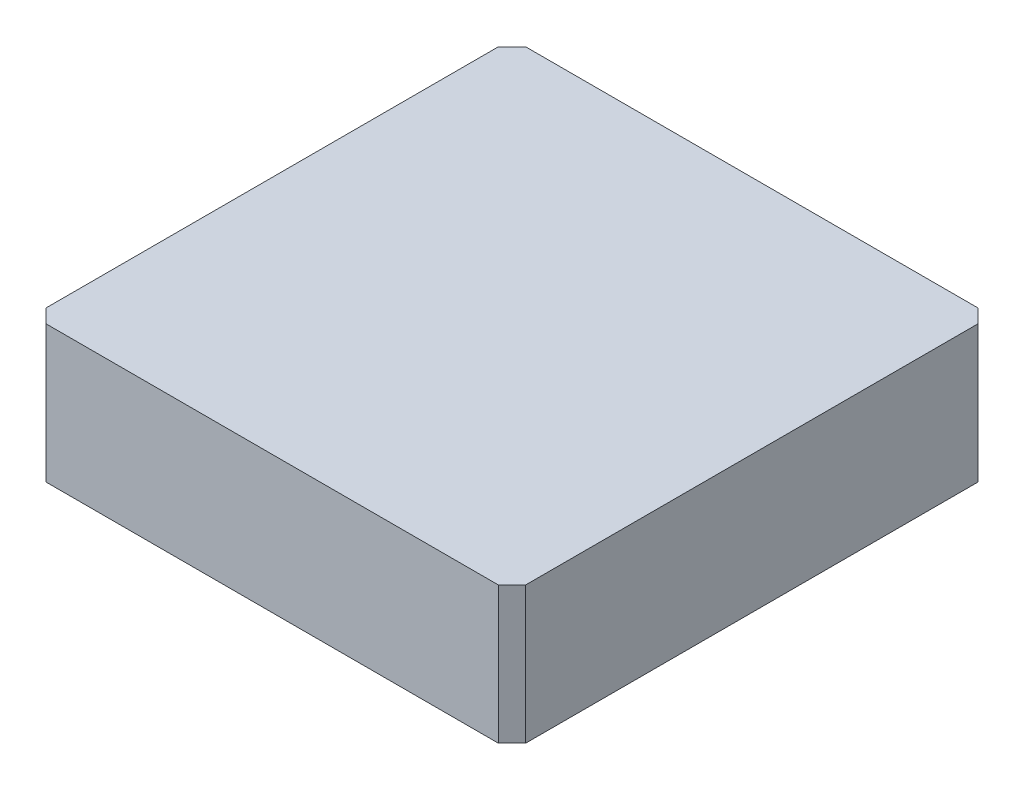
ISO-10303-21;
HEADER;
FILE_DESCRIPTION(('STEP AP214'),'2;1');
FILE_NAME('part.step','',(''),(''),'','','');
FILE_SCHEMA(('AUTOMOTIVE_DESIGN { 1 0 10303 214 1 1 1 1 }'));
ENDSEC;
DATA;
#1=APPLICATION_CONTEXT('core data for automotive mechanical design processes');
#2=APPLICATION_PROTOCOL_DEFINITION('international standard','automotive_design',2000,#1);
#3=PRODUCT_CONTEXT('',#1,'mechanical');
#4=PRODUCT('Part','Part','',(#3));
#5=PRODUCT_RELATED_PRODUCT_CATEGORY('part','',(#4));
#6=PRODUCT_DEFINITION_FORMATION('','',#4);
#7=PRODUCT_DEFINITION_CONTEXT('part definition',#1,'design');
#8=PRODUCT_DEFINITION('design','',#6,#7);
#9=PRODUCT_DEFINITION_SHAPE('','',#8);
#10=(LENGTH_UNIT() NAMED_UNIT(*) SI_UNIT(.MILLI.,.METRE.));
#11=(NAMED_UNIT(*) PLANE_ANGLE_UNIT() SI_UNIT($,.RADIAN.));
#12=(NAMED_UNIT(*) SI_UNIT($,.STERADIAN.) SOLID_ANGLE_UNIT());
#13=UNCERTAINTY_MEASURE_WITH_UNIT(LENGTH_MEASURE(1.E-05),#10,'distance_accuracy_value','');
#14=(GEOMETRIC_REPRESENTATION_CONTEXT(3) GLOBAL_UNCERTAINTY_ASSIGNED_CONTEXT((#13)) GLOBAL_UNIT_ASSIGNED_CONTEXT((#10,
#11,#12)) REPRESENTATION_CONTEXT('',''));
#15=CARTESIAN_POINT('',(0.,0.,0.));
#16=DIRECTION('',(0.,0.,1.));
#17=DIRECTION('',(1.,0.,0.));
#18=AXIS2_PLACEMENT_3D('',#15,#16,#17);
#19=CARTESIAN_POINT('',(-35.,20.,35.));
#20=DIRECTION('',(1.,0.,0.));
#21=DIRECTION('',(0.,0.,-1.));
#22=AXIS2_PLACEMENT_3D('',#19,#20,#21);
#23=PLANE('',#22);
#24=DIRECTION('',(0.,0.,1.));
#25=VECTOR('',#24,1.);
#26=CARTESIAN_POINT('',(-35.,0.,35.));
#27=LINE('',#26,#25);
#28=CARTESIAN_POINT('',(-35.,0.,-33.));
#29=VERTEX_POINT('',#28);
#30=CARTESIAN_POINT('',(-35.,0.,33.));
#31=VERTEX_POINT('',#30);
#32=EDGE_CURVE('E125',#29,#31,#27,.T.);
#33=ORIENTED_EDGE('',*,*,#32,.T.);
#34=DIRECTION('',(0.,1.,0.));
#35=VECTOR('',#34,1.);
#36=CARTESIAN_POINT('',(-35.,20.,33.));
#37=LINE('',#36,#35);
#38=CARTESIAN_POINT('',(-35.,20.,33.));
#39=VERTEX_POINT('',#38);
#40=EDGE_CURVE('E103',#31,#39,#37,.T.);
#41=ORIENTED_EDGE('',*,*,#40,.T.);
#42=DIRECTION('',(0.,0.,1.));
#43=VECTOR('',#42,1.);
#44=CARTESIAN_POINT('',(-35.,20.,35.));
#45=LINE('',#44,#43);
#46=CARTESIAN_POINT('',(-35.,20.,-33.));
#47=VERTEX_POINT('',#46);
#48=EDGE_CURVE('E134',#47,#39,#45,.T.);
#49=ORIENTED_EDGE('',*,*,#48,.F.);
#50=DIRECTION('',(0.,-1.,0.));
#51=VECTOR('',#50,1.);
#52=CARTESIAN_POINT('',(-35.,20.,-33.));
#53=LINE('',#52,#51);
#54=EDGE_CURVE('E108',#47,#29,#53,.T.);
#55=ORIENTED_EDGE('',*,*,#54,.T.);
#56=EDGE_LOOP('',(#33,#41,#49,#55));
#57=FACE_BOUND('',#56,.T.);
#58=ADVANCED_FACE('F32',(#57),#23,.F.);
#59=CARTESIAN_POINT('',(35.,20.,35.));
#60=DIRECTION('',(0.,0.,-1.));
#61=DIRECTION('',(-1.,0.,0.));
#62=AXIS2_PLACEMENT_3D('',#59,#60,#61);
#63=PLANE('',#62);
#64=DIRECTION('',(1.,0.,0.));
#65=VECTOR('',#64,1.);
#66=CARTESIAN_POINT('',(35.,20.,35.));
#67=LINE('',#66,#65);
#68=CARTESIAN_POINT('',(-33.,20.,35.));
#69=VERTEX_POINT('',#68);
#70=CARTESIAN_POINT('',(33.,20.,35.));
#71=VERTEX_POINT('',#70);
#72=EDGE_CURVE('E118',#69,#71,#67,.T.);
#73=ORIENTED_EDGE('',*,*,#72,.F.);
#74=DIRECTION('',(0.,-1.,0.));
#75=VECTOR('',#74,1.);
#76=CARTESIAN_POINT('',(-33.,20.,35.));
#77=LINE('',#76,#75);
#78=CARTESIAN_POINT('',(-33.,0.,35.));
#79=VERTEX_POINT('',#78);
#80=EDGE_CURVE('E102',#69,#79,#77,.T.);
#81=ORIENTED_EDGE('',*,*,#80,.T.);
#82=DIRECTION('',(1.,0.,0.));
#83=VECTOR('',#82,1.);
#84=CARTESIAN_POINT('',(35.,0.,35.));
#85=LINE('',#84,#83);
#86=CARTESIAN_POINT('',(33.,0.,35.));
#87=VERTEX_POINT('',#86);
#88=EDGE_CURVE('E115',#79,#87,#85,.T.);
#89=ORIENTED_EDGE('',*,*,#88,.T.);
#90=DIRECTION('',(0.,1.,0.));
#91=VECTOR('',#90,1.);
#92=CARTESIAN_POINT('',(33.,20.,35.));
#93=LINE('',#92,#91);
#94=EDGE_CURVE('E120',#87,#71,#93,.T.);
#95=ORIENTED_EDGE('',*,*,#94,.T.);
#96=EDGE_LOOP('',(#73,#81,#89,#95));
#97=FACE_BOUND('',#96,.T.);
#98=ADVANCED_FACE('F114',(#97),#63,.F.);
#99=CARTESIAN_POINT('',(35.,20.,35.));
#100=DIRECTION('',(-1.,0.,0.));
#101=DIRECTION('',(0.,0.,1.));
#102=AXIS2_PLACEMENT_3D('',#99,#100,#101);
#103=PLANE('',#102);
#104=DIRECTION('',(0.,0.,-1.));
#105=VECTOR('',#104,1.);
#106=CARTESIAN_POINT('',(35.,0.,35.));
#107=LINE('',#106,#105);
#108=CARTESIAN_POINT('',(35.,0.,33.));
#109=VERTEX_POINT('',#108);
#110=CARTESIAN_POINT('',(35.,0.,-33.));
#111=VERTEX_POINT('',#110);
#112=EDGE_CURVE('E124',#109,#111,#107,.T.);
#113=ORIENTED_EDGE('',*,*,#112,.T.);
#114=DIRECTION('',(0.,1.,0.));
#115=VECTOR('',#114,1.);
#116=CARTESIAN_POINT('',(35.,20.,-33.));
#117=LINE('',#116,#115);
#118=CARTESIAN_POINT('',(35.,20.,-33.));
#119=VERTEX_POINT('',#118);
#120=EDGE_CURVE('E11',#111,#119,#117,.T.);
#121=ORIENTED_EDGE('',*,*,#120,.T.);
#122=DIRECTION('',(0.,0.,-1.));
#123=VECTOR('',#122,1.);
#124=CARTESIAN_POINT('',(35.,20.,35.));
#125=LINE('',#124,#123);
#126=CARTESIAN_POINT('',(35.,20.,33.));
#127=VERTEX_POINT('',#126);
#128=EDGE_CURVE('E160',#127,#119,#125,.T.);
#129=ORIENTED_EDGE('',*,*,#128,.F.);
#130=DIRECTION('',(0.,-1.,0.));
#131=VECTOR('',#130,1.);
#132=CARTESIAN_POINT('',(35.,20.,33.));
#133=LINE('',#132,#131);
#134=EDGE_CURVE('E40',#127,#109,#133,.T.);
#135=ORIENTED_EDGE('',*,*,#134,.T.);
#136=EDGE_LOOP('',(#113,#121,#129,#135));
#137=FACE_BOUND('',#136,.T.);
#138=ADVANCED_FACE('F158',(#137),#103,.F.);
#139=CARTESIAN_POINT('',(35.,20.,-35.));
#140=DIRECTION('',(0.,0.,1.));
#141=DIRECTION('',(1.,0.,0.));
#142=AXIS2_PLACEMENT_3D('',#139,#140,#141);
#143=PLANE('',#142);
#144=DIRECTION('',(-1.,0.,0.));
#145=VECTOR('',#144,1.);
#146=CARTESIAN_POINT('',(35.,0.,-35.));
#147=LINE('',#146,#145);
#148=CARTESIAN_POINT('',(33.,0.,-35.));
#149=VERTEX_POINT('',#148);
#150=CARTESIAN_POINT('',(-33.,0.,-35.));
#151=VERTEX_POINT('',#150);
#152=EDGE_CURVE('E128',#149,#151,#147,.T.);
#153=ORIENTED_EDGE('',*,*,#152,.T.);
#154=DIRECTION('',(0.,1.,0.));
#155=VECTOR('',#154,1.);
#156=CARTESIAN_POINT('',(-33.,20.,-35.));
#157=LINE('',#156,#155);
#158=CARTESIAN_POINT('',(-33.,20.,-35.));
#159=VERTEX_POINT('',#158);
#160=EDGE_CURVE('E47',#151,#159,#157,.T.);
#161=ORIENTED_EDGE('',*,*,#160,.T.);
#162=DIRECTION('',(-1.,0.,0.));
#163=VECTOR('',#162,1.);
#164=CARTESIAN_POINT('',(35.,20.,-35.));
#165=LINE('',#164,#163);
#166=CARTESIAN_POINT('',(33.,20.,-35.));
#167=VERTEX_POINT('',#166);
#168=EDGE_CURVE('E135',#167,#159,#165,.T.);
#169=ORIENTED_EDGE('',*,*,#168,.F.);
#170=DIRECTION('',(0.,-1.,0.));
#171=VECTOR('',#170,1.);
#172=CARTESIAN_POINT('',(33.,20.,-35.));
#173=LINE('',#172,#171);
#174=EDGE_CURVE('E151',#167,#149,#173,.T.);
#175=ORIENTED_EDGE('',*,*,#174,.T.);
#176=EDGE_LOOP('',(#153,#161,#169,#175));
#177=FACE_BOUND('',#176,.T.);
#178=ADVANCED_FACE('F167',(#177),#143,.F.);
#179=CARTESIAN_POINT('',(0.,20.,0.));
#180=DIRECTION('',(0.,1.,0.));
#181=DIRECTION('',(0.,0.,1.));
#182=AXIS2_PLACEMENT_3D('',#179,#180,#181);
#183=PLANE('',#182);
#184=ORIENTED_EDGE('',*,*,#48,.T.);
#185=DIRECTION('',(-0.707106781186548,0.,-0.707106781186548));
#186=VECTOR('',#185,1.);
#187=CARTESIAN_POINT('',(-34.,20.,34.));
#188=LINE('',#187,#186);
#189=EDGE_CURVE('E149',#39,#69,#188,.F.);
#190=ORIENTED_EDGE('',*,*,#189,.T.);
#191=ORIENTED_EDGE('',*,*,#72,.T.);
#192=DIRECTION('',(-0.707106781186548,0.,0.707106781186548));
#193=VECTOR('',#192,1.);
#194=CARTESIAN_POINT('',(34.,20.,34.));
#195=LINE('',#194,#193);
#196=EDGE_CURVE('E144',#71,#127,#195,.F.);
#197=ORIENTED_EDGE('',*,*,#196,.T.);
#198=ORIENTED_EDGE('',*,*,#128,.T.);
#199=DIRECTION('',(0.707106781186548,0.,0.707106781186548));
#200=VECTOR('',#199,1.);
#201=CARTESIAN_POINT('',(34.,20.,-34.));
#202=LINE('',#201,#200);
#203=EDGE_CURVE('E54',#119,#167,#202,.F.);
#204=ORIENTED_EDGE('',*,*,#203,.T.);
#205=ORIENTED_EDGE('',*,*,#168,.T.);
#206=DIRECTION('',(0.707106781186548,0.,-0.707106781186548));
#207=VECTOR('',#206,1.);
#208=CARTESIAN_POINT('',(-34.,20.,-34.));
#209=LINE('',#208,#207);
#210=EDGE_CURVE('E147',#159,#47,#209,.F.);
#211=ORIENTED_EDGE('',*,*,#210,.T.);
#212=EDGE_LOOP('',(#184,#190,#191,#197,#198,#204,#205,#211));
#213=FACE_BOUND('',#212,.T.);
#214=ADVANCED_FACE('F174',(#213),#183,.T.);
#215=CARTESIAN_POINT('',(0.,0.,0.));
#216=DIRECTION('',(0.,1.,0.));
#217=DIRECTION('',(0.,0.,1.));
#218=AXIS2_PLACEMENT_3D('',#215,#216,#217);
#219=PLANE('',#218);
#220=ORIENTED_EDGE('',*,*,#88,.F.);
#221=DIRECTION('',(0.707106781186548,0.,0.707106781186548));
#222=VECTOR('',#221,1.);
#223=CARTESIAN_POINT('',(-33.,0.,35.));
#224=LINE('',#223,#222);
#225=EDGE_CURVE('E98',#79,#31,#224,.F.);
#226=ORIENTED_EDGE('',*,*,#225,.T.);
#227=ORIENTED_EDGE('',*,*,#32,.F.);
#228=DIRECTION('',(-0.707106781186548,0.,0.707106781186548));
#229=VECTOR('',#228,1.);
#230=CARTESIAN_POINT('',(-35.,0.,-33.));
#231=LINE('',#230,#229);
#232=EDGE_CURVE('E109',#29,#151,#231,.F.);
#233=ORIENTED_EDGE('',*,*,#232,.T.);
#234=ORIENTED_EDGE('',*,*,#152,.F.);
#235=DIRECTION('',(-0.707106781186548,0.,-0.707106781186548));
#236=VECTOR('',#235,1.);
#237=CARTESIAN_POINT('',(33.,0.,-35.));
#238=LINE('',#237,#236);
#239=EDGE_CURVE('E138',#149,#111,#238,.F.);
#240=ORIENTED_EDGE('',*,*,#239,.T.);
#241=ORIENTED_EDGE('',*,*,#112,.F.);
#242=DIRECTION('',(0.707106781186548,0.,-0.707106781186548));
#243=VECTOR('',#242,1.);
#244=CARTESIAN_POINT('',(35.,0.,33.));
#245=LINE('',#244,#243);
#246=EDGE_CURVE('E119',#109,#87,#245,.F.);
#247=ORIENTED_EDGE('',*,*,#246,.T.);
#248=EDGE_LOOP('',(#220,#226,#227,#233,#234,#240,#241,#247));
#249=FACE_BOUND('',#248,.T.);
#250=ADVANCED_FACE('F122',(#249),#219,.F.);
#251=CARTESIAN_POINT('',(-33.,20.,35.));
#252=DIRECTION('',(0.707106781186547,0.,-0.707106781186547));
#253=DIRECTION('',(0.,-1.,0.));
#254=AXIS2_PLACEMENT_3D('',#251,#252,#253);
#255=PLANE('',#254);
#256=ORIENTED_EDGE('',*,*,#189,.F.);
#257=ORIENTED_EDGE('',*,*,#40,.F.);
#258=ORIENTED_EDGE('',*,*,#225,.F.);
#259=ORIENTED_EDGE('',*,*,#80,.F.);
#260=EDGE_LOOP('',(#256,#257,#258,#259));
#261=FACE_BOUND('',#260,.T.);
#262=ADVANCED_FACE('F101',(#261),#255,.F.);
#263=CARTESIAN_POINT('',(-35.,20.,-33.));
#264=DIRECTION('',(0.707106781186547,0.,0.707106781186547));
#265=DIRECTION('',(0.,-1.,0.));
#266=AXIS2_PLACEMENT_3D('',#263,#264,#265);
#267=PLANE('',#266);
#268=ORIENTED_EDGE('',*,*,#210,.F.);
#269=ORIENTED_EDGE('',*,*,#160,.F.);
#270=ORIENTED_EDGE('',*,*,#232,.F.);
#271=ORIENTED_EDGE('',*,*,#54,.F.);
#272=EDGE_LOOP('',(#268,#269,#270,#271));
#273=FACE_BOUND('',#272,.T.);
#274=ADVANCED_FACE('F178',(#273),#267,.F.);
#275=CARTESIAN_POINT('',(33.,20.,-35.));
#276=DIRECTION('',(-0.707106781186547,0.,0.707106781186547));
#277=DIRECTION('',(0.,-1.,0.));
#278=AXIS2_PLACEMENT_3D('',#275,#276,#277);
#279=PLANE('',#278);
#280=ORIENTED_EDGE('',*,*,#203,.F.);
#281=ORIENTED_EDGE('',*,*,#120,.F.);
#282=ORIENTED_EDGE('',*,*,#239,.F.);
#283=ORIENTED_EDGE('',*,*,#174,.F.);
#284=EDGE_LOOP('',(#280,#281,#282,#283));
#285=FACE_BOUND('',#284,.T.);
#286=ADVANCED_FACE('F166',(#285),#279,.F.);
#287=CARTESIAN_POINT('',(35.,20.,33.));
#288=DIRECTION('',(-0.707106781186547,0.,-0.707106781186547));
#289=DIRECTION('',(0.,-1.,0.));
#290=AXIS2_PLACEMENT_3D('',#287,#288,#289);
#291=PLANE('',#290);
#292=ORIENTED_EDGE('',*,*,#196,.F.);
#293=ORIENTED_EDGE('',*,*,#94,.F.);
#294=ORIENTED_EDGE('',*,*,#246,.F.);
#295=ORIENTED_EDGE('',*,*,#134,.F.);
#296=EDGE_LOOP('',(#292,#293,#294,#295));
#297=FACE_BOUND('',#296,.T.);
#298=ADVANCED_FACE('F34',(#297),#291,.F.);
#299=CLOSED_SHELL('',(#58,#98,#138,#178,#214,#250,#262,#274,#286,#298));
#300=MANIFOLD_SOLID_BREP('B2',#299);
#301=ADVANCED_BREP_SHAPE_REPRESENTATION('',(#18,#300),#14);
#302=SHAPE_DEFINITION_REPRESENTATION(#9,#301);
ENDSEC;
END-ISO-10303-21;
